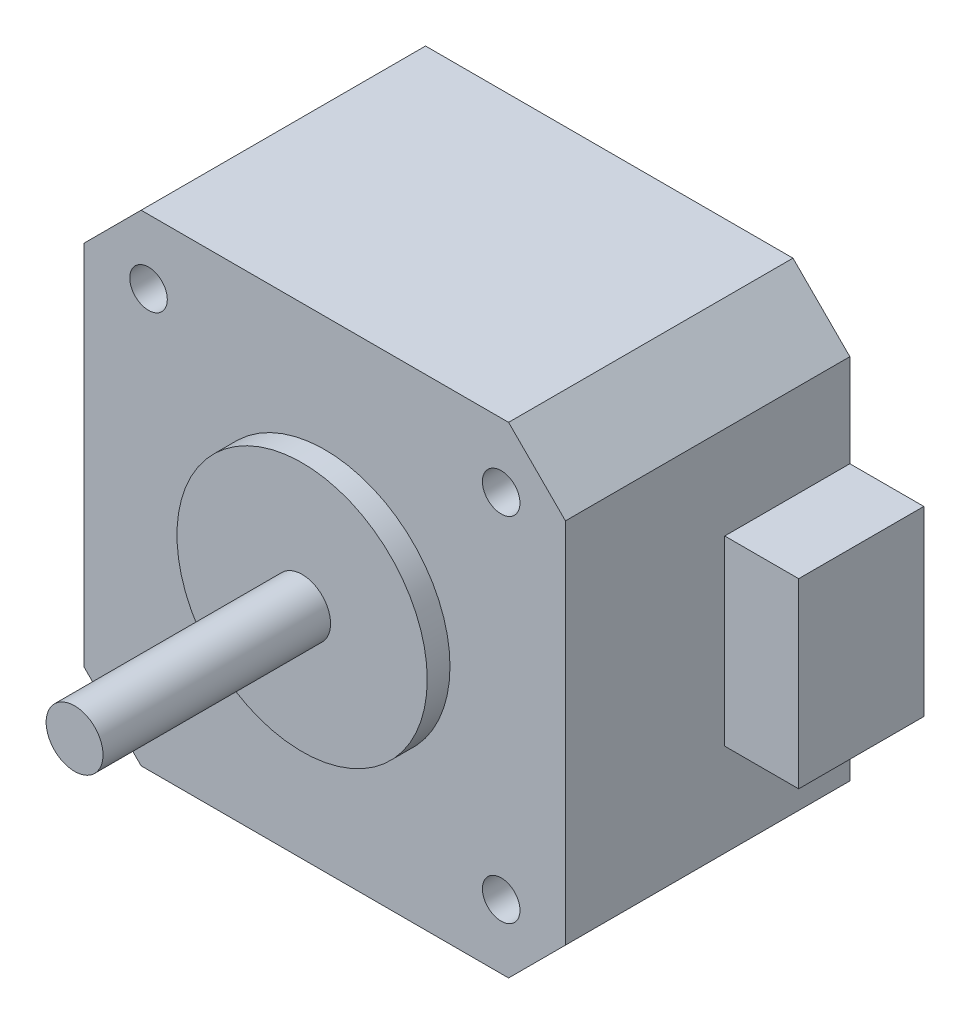
ISO-10303-21;
HEADER;
FILE_DESCRIPTION(('STEP AP214'),'2;1');
FILE_NAME('part.step','',(''),(''),'','','');
FILE_SCHEMA(('AUTOMOTIVE_DESIGN { 1 0 10303 214 1 1 1 1 }'));
ENDSEC;
DATA;
#1=APPLICATION_CONTEXT('core data for automotive mechanical design processes');
#2=APPLICATION_PROTOCOL_DEFINITION('international standard','automotive_design',2000,#1);
#3=PRODUCT_CONTEXT('',#1,'mechanical');
#4=PRODUCT('Part','Part','',(#3));
#5=PRODUCT_RELATED_PRODUCT_CATEGORY('part','',(#4));
#6=PRODUCT_DEFINITION_FORMATION('','',#4);
#7=PRODUCT_DEFINITION_CONTEXT('part definition',#1,'design');
#8=PRODUCT_DEFINITION('design','',#6,#7);
#9=PRODUCT_DEFINITION_SHAPE('','',#8);
#10=(LENGTH_UNIT() NAMED_UNIT(*) SI_UNIT(.MILLI.,.METRE.));
#11=(NAMED_UNIT(*) PLANE_ANGLE_UNIT() SI_UNIT($,.RADIAN.));
#12=(NAMED_UNIT(*) SI_UNIT($,.STERADIAN.) SOLID_ANGLE_UNIT());
#13=UNCERTAINTY_MEASURE_WITH_UNIT(LENGTH_MEASURE(1.E-05),#10,'distance_accuracy_value','');
#14=(GEOMETRIC_REPRESENTATION_CONTEXT(3) GLOBAL_UNCERTAINTY_ASSIGNED_CONTEXT((#13)) GLOBAL_UNIT_ASSIGNED_CONTEXT((#10,
#11,#12)) REPRESENTATION_CONTEXT('',''));
#15=CARTESIAN_POINT('',(0.,0.,0.));
#16=DIRECTION('',(0.,0.,1.));
#17=DIRECTION('',(1.,0.,0.));
#18=AXIS2_PLACEMENT_3D('',#15,#16,#17);
#19=CARTESIAN_POINT('',(27.65,-8.,11.));
#20=DIRECTION('',(0.,0.,-1.));
#21=DIRECTION('',(0.,1.,0.));
#22=AXIS2_PLACEMENT_3D('',#19,#20,#21);
#23=PLANE('',#22);
#24=DIRECTION('',(0.,-1.,0.));
#25=VECTOR('',#24,1.);
#26=CARTESIAN_POINT('',(21.15,-8.,11.));
#27=LINE('',#26,#25);
#28=CARTESIAN_POINT('',(21.15,8.,11.));
#29=VERTEX_POINT('',#28);
#30=CARTESIAN_POINT('',(21.15,-8.,11.));
#31=VERTEX_POINT('',#30);
#32=EDGE_CURVE('E110',#29,#31,#27,.T.);
#33=ORIENTED_EDGE('',*,*,#32,.T.);
#34=DIRECTION('',(-1.,0.,0.));
#35=VECTOR('',#34,1.);
#36=CARTESIAN_POINT('',(27.65,-8.,11.));
#37=LINE('',#36,#35);
#38=CARTESIAN_POINT('',(27.65,-8.,11.));
#39=VERTEX_POINT('',#38);
#40=EDGE_CURVE('E12',#39,#31,#37,.T.);
#41=ORIENTED_EDGE('',*,*,#40,.F.);
#42=DIRECTION('',(0.,-1.,0.));
#43=VECTOR('',#42,1.);
#44=CARTESIAN_POINT('',(27.65,-8.,11.));
#45=LINE('',#44,#43);
#46=CARTESIAN_POINT('',(27.65,8.,11.));
#47=VERTEX_POINT('',#46);
#48=EDGE_CURVE('E98',#47,#39,#45,.T.);
#49=ORIENTED_EDGE('',*,*,#48,.F.);
#50=DIRECTION('',(-1.,0.,0.));
#51=VECTOR('',#50,1.);
#52=CARTESIAN_POINT('',(27.65,8.,11.));
#53=LINE('',#52,#51);
#54=EDGE_CURVE('E106',#47,#29,#53,.T.);
#55=ORIENTED_EDGE('',*,*,#54,.T.);
#56=EDGE_LOOP('',(#33,#41,#49,#55));
#57=FACE_BOUND('',#56,.T.);
#58=ADVANCED_FACE('F47',(#57),#23,.F.);
#59=CARTESIAN_POINT('',(27.65,-8.,11.));
#60=DIRECTION('',(0.,1.,0.));
#61=DIRECTION('',(0.,0.,1.));
#62=AXIS2_PLACEMENT_3D('',#59,#60,#61);
#63=PLANE('',#62);
#64=DIRECTION('',(0.,0.,-1.));
#65=VECTOR('',#64,1.);
#66=CARTESIAN_POINT('',(21.15,-8.,11.));
#67=LINE('',#66,#65);
#68=CARTESIAN_POINT('',(21.15,-8.,0.));
#69=VERTEX_POINT('',#68);
#70=EDGE_CURVE('E102',#31,#69,#67,.T.);
#71=ORIENTED_EDGE('',*,*,#70,.T.);
#72=DIRECTION('',(-1.,0.,0.));
#73=VECTOR('',#72,1.);
#74=CARTESIAN_POINT('',(27.65,-8.,0.));
#75=LINE('',#74,#73);
#76=CARTESIAN_POINT('',(27.65,-8.,0.));
#77=VERTEX_POINT('',#76);
#78=EDGE_CURVE('E55',#77,#69,#75,.T.);
#79=ORIENTED_EDGE('',*,*,#78,.F.);
#80=DIRECTION('',(0.,0.,-1.));
#81=VECTOR('',#80,1.);
#82=CARTESIAN_POINT('',(27.65,-8.,11.));
#83=LINE('',#82,#81);
#84=EDGE_CURVE('E93',#39,#77,#83,.T.);
#85=ORIENTED_EDGE('',*,*,#84,.F.);
#86=ORIENTED_EDGE('',*,*,#40,.T.);
#87=EDGE_LOOP('',(#71,#79,#85,#86));
#88=FACE_BOUND('',#87,.T.);
#89=ADVANCED_FACE('F101',(#88),#63,.F.);
#90=CARTESIAN_POINT('',(27.65,-8.,0.));
#91=DIRECTION('',(0.,0.,1.));
#92=DIRECTION('',(0.,-1.,0.));
#93=AXIS2_PLACEMENT_3D('',#90,#91,#92);
#94=PLANE('',#93);
#95=DIRECTION('',(0.,1.,0.));
#96=VECTOR('',#95,1.);
#97=CARTESIAN_POINT('',(21.15,-8.,0.));
#98=LINE('',#97,#96);
#99=CARTESIAN_POINT('',(21.15,8.,0.));
#100=VERTEX_POINT('',#99);
#101=EDGE_CURVE('E80',#69,#100,#98,.T.);
#102=ORIENTED_EDGE('',*,*,#101,.T.);
#103=DIRECTION('',(-1.,0.,0.));
#104=VECTOR('',#103,1.);
#105=CARTESIAN_POINT('',(27.65,8.,0.));
#106=LINE('',#105,#104);
#107=CARTESIAN_POINT('',(27.65,8.,0.));
#108=VERTEX_POINT('',#107);
#109=EDGE_CURVE('E103',#108,#100,#106,.T.);
#110=ORIENTED_EDGE('',*,*,#109,.F.);
#111=DIRECTION('',(0.,1.,0.));
#112=VECTOR('',#111,1.);
#113=CARTESIAN_POINT('',(27.65,-8.,0.));
#114=LINE('',#113,#112);
#115=EDGE_CURVE('E96',#77,#108,#114,.T.);
#116=ORIENTED_EDGE('',*,*,#115,.F.);
#117=ORIENTED_EDGE('',*,*,#78,.T.);
#118=EDGE_LOOP('',(#102,#110,#116,#117));
#119=FACE_BOUND('',#118,.T.);
#120=ADVANCED_FACE('F104',(#119),#94,.F.);
#121=CARTESIAN_POINT('',(27.65,8.,11.));
#122=DIRECTION('',(0.,-1.,0.));
#123=DIRECTION('',(0.,0.,-1.));
#124=AXIS2_PLACEMENT_3D('',#121,#122,#123);
#125=PLANE('',#124);
#126=DIRECTION('',(0.,0.,1.));
#127=VECTOR('',#126,1.);
#128=CARTESIAN_POINT('',(21.15,8.,11.));
#129=LINE('',#128,#127);
#130=EDGE_CURVE('E86',#100,#29,#129,.T.);
#131=ORIENTED_EDGE('',*,*,#130,.T.);
#132=ORIENTED_EDGE('',*,*,#54,.F.);
#133=DIRECTION('',(0.,0.,1.));
#134=VECTOR('',#133,1.);
#135=CARTESIAN_POINT('',(27.65,8.,11.));
#136=LINE('',#135,#134);
#137=EDGE_CURVE('E63',#108,#47,#136,.T.);
#138=ORIENTED_EDGE('',*,*,#137,.F.);
#139=ORIENTED_EDGE('',*,*,#109,.T.);
#140=EDGE_LOOP('',(#131,#132,#138,#139));
#141=FACE_BOUND('',#140,.T.);
#142=ADVANCED_FACE('F117',(#141),#125,.F.);
#143=CARTESIAN_POINT('',(27.65,0.,0.));
#144=DIRECTION('',(-1.,0.,0.));
#145=DIRECTION('',(0.,0.,1.));
#146=AXIS2_PLACEMENT_3D('',#143,#144,#145);
#147=PLANE('',#146);
#148=ORIENTED_EDGE('',*,*,#48,.T.);
#149=ORIENTED_EDGE('',*,*,#84,.T.);
#150=ORIENTED_EDGE('',*,*,#115,.T.);
#151=ORIENTED_EDGE('',*,*,#137,.T.);
#152=EDGE_LOOP('',(#148,#149,#150,#151));
#153=FACE_BOUND('',#152,.T.);
#154=ADVANCED_FACE('F94',(#153),#147,.F.);
#155=CARTESIAN_POINT('',(21.15,0.,0.));
#156=DIRECTION('',(-1.,0.,0.));
#157=DIRECTION('',(0.,0.,1.));
#158=AXIS2_PLACEMENT_3D('',#155,#156,#157);
#159=PLANE('',#158);
#160=ORIENTED_EDGE('',*,*,#32,.F.);
#161=ORIENTED_EDGE('',*,*,#130,.F.);
#162=ORIENTED_EDGE('',*,*,#101,.F.);
#163=ORIENTED_EDGE('',*,*,#70,.F.);
#164=EDGE_LOOP('',(#160,#161,#162,#163));
#165=FACE_BOUND('',#164,.T.);
#166=ADVANCED_FACE('F120',(#165),#159,.T.);
#167=CLOSED_SHELL('',(#58,#89,#120,#142,#154,#166));
#168=MANIFOLD_SOLID_BREP('B2',#167);
#169=CARTESIAN_POINT('',(21.15,-21.1500000000001,25.));
#170=DIRECTION('',(-1.,0.,0.));
#171=DIRECTION('',(0.,0.,1.));
#172=AXIS2_PLACEMENT_3D('',#169,#170,#171);
#173=PLANE('',#172);
#174=DIRECTION('',(0.,1.,0.));
#175=VECTOR('',#174,1.);
#176=CARTESIAN_POINT('',(21.15,-21.1500000000001,25.));
#177=LINE('',#176,#175);
#178=CARTESIAN_POINT('',(21.15,-16.1500000000001,25.));
#179=VERTEX_POINT('',#178);
#180=CARTESIAN_POINT('',(21.15,16.1499999999999,25.));
#181=VERTEX_POINT('',#180);
#182=EDGE_CURVE('E293',#179,#181,#177,.T.);
#183=ORIENTED_EDGE('',*,*,#182,.F.);
#184=DIRECTION('',(0.,0.,-1.));
#185=VECTOR('',#184,1.);
#186=CARTESIAN_POINT('',(21.15,-16.1500000000001,25.));
#187=LINE('',#186,#185);
#188=CARTESIAN_POINT('',(21.15,-16.1500000000001,0.));
#189=VERTEX_POINT('',#188);
#190=EDGE_CURVE('E340',#179,#189,#187,.T.);
#191=ORIENTED_EDGE('',*,*,#190,.T.);
#192=DIRECTION('',(0.,1.,0.));
#193=VECTOR('',#192,1.);
#194=CARTESIAN_POINT('',(21.15,-21.1500000000001,0.));
#195=LINE('',#194,#193);
#196=CARTESIAN_POINT('',(21.15,16.1499999999999,0.));
#197=VERTEX_POINT('',#196);
#198=EDGE_CURVE('E290',#189,#197,#195,.T.);
#199=ORIENTED_EDGE('',*,*,#198,.T.);
#200=DIRECTION('',(0.,0.,1.));
#201=VECTOR('',#200,1.);
#202=CARTESIAN_POINT('',(21.15,16.1499999999999,25.));
#203=LINE('',#202,#201);
#204=EDGE_CURVE('E338',#197,#181,#203,.T.);
#205=ORIENTED_EDGE('',*,*,#204,.T.);
#206=EDGE_LOOP('',(#183,#191,#199,#205));
#207=FACE_BOUND('',#206,.T.);
#208=ADVANCED_FACE('F171',(#207),#173,.F.);
#209=CARTESIAN_POINT('',(-21.15,21.1499999999999,25.));
#210=DIRECTION('',(0.,-1.,0.));
#211=DIRECTION('',(0.,0.,-1.));
#212=AXIS2_PLACEMENT_3D('',#209,#210,#211);
#213=PLANE('',#212);
#214=DIRECTION('',(-1.,0.,0.));
#215=VECTOR('',#214,1.);
#216=CARTESIAN_POINT('',(-21.15,21.1499999999999,25.));
#217=LINE('',#216,#215);
#218=CARTESIAN_POINT('',(16.15,21.1499999999999,25.));
#219=VERTEX_POINT('',#218);
#220=CARTESIAN_POINT('',(-16.15,21.1499999999999,25.));
#221=VERTEX_POINT('',#220);
#222=EDGE_CURVE('E295',#219,#221,#217,.T.);
#223=ORIENTED_EDGE('',*,*,#222,.F.);
#224=DIRECTION('',(0.,0.,-1.));
#225=VECTOR('',#224,1.);
#226=CARTESIAN_POINT('',(16.15,21.1499999999999,25.));
#227=LINE('',#226,#225);
#228=CARTESIAN_POINT('',(16.15,21.1499999999999,0.));
#229=VERTEX_POINT('',#228);
#230=EDGE_CURVE('E176',#219,#229,#227,.T.);
#231=ORIENTED_EDGE('',*,*,#230,.T.);
#232=DIRECTION('',(-1.,0.,0.));
#233=VECTOR('',#232,1.);
#234=CARTESIAN_POINT('',(-21.15,21.1499999999999,0.));
#235=LINE('',#234,#233);
#236=CARTESIAN_POINT('',(-16.15,21.1499999999999,0.));
#237=VERTEX_POINT('',#236);
#238=EDGE_CURVE('E307',#229,#237,#235,.T.);
#239=ORIENTED_EDGE('',*,*,#238,.T.);
#240=DIRECTION('',(0.,0.,1.));
#241=VECTOR('',#240,1.);
#242=CARTESIAN_POINT('',(-16.15,21.1499999999999,25.));
#243=LINE('',#242,#241);
#244=EDGE_CURVE('E189',#237,#221,#243,.T.);
#245=ORIENTED_EDGE('',*,*,#244,.T.);
#246=EDGE_LOOP('',(#223,#231,#239,#245));
#247=FACE_BOUND('',#246,.T.);
#248=ADVANCED_FACE('F345',(#247),#213,.F.);
#249=CARTESIAN_POINT('',(-21.15,-21.1500000000001,25.));
#250=DIRECTION('',(1.,0.,0.));
#251=DIRECTION('',(0.,0.,-1.));
#252=AXIS2_PLACEMENT_3D('',#249,#250,#251);
#253=PLANE('',#252);
#254=DIRECTION('',(0.,-1.,0.));
#255=VECTOR('',#254,1.);
#256=CARTESIAN_POINT('',(-21.15,-21.1500000000001,0.));
#257=LINE('',#256,#255);
#258=CARTESIAN_POINT('',(-21.15,16.1499999999999,0.));
#259=VERTEX_POINT('',#258);
#260=CARTESIAN_POINT('',(-21.15,-16.1500000000001,0.));
#261=VERTEX_POINT('',#260);
#262=EDGE_CURVE('E309',#259,#261,#257,.T.);
#263=ORIENTED_EDGE('',*,*,#262,.T.);
#264=DIRECTION('',(0.,0.,1.));
#265=VECTOR('',#264,1.);
#266=CARTESIAN_POINT('',(-21.15,-16.1500000000001,25.));
#267=LINE('',#266,#265);
#268=CARTESIAN_POINT('',(-21.15,-16.1500000000001,25.));
#269=VERTEX_POINT('',#268);
#270=EDGE_CURVE('E329',#261,#269,#267,.T.);
#271=ORIENTED_EDGE('',*,*,#270,.T.);
#272=DIRECTION('',(0.,-1.,0.));
#273=VECTOR('',#272,1.);
#274=CARTESIAN_POINT('',(-21.15,-21.1500000000001,25.));
#275=LINE('',#274,#273);
#276=CARTESIAN_POINT('',(-21.15,16.1499999999999,25.));
#277=VERTEX_POINT('',#276);
#278=EDGE_CURVE('E298',#277,#269,#275,.T.);
#279=ORIENTED_EDGE('',*,*,#278,.F.);
#280=DIRECTION('',(0.,0.,-1.));
#281=VECTOR('',#280,1.);
#282=CARTESIAN_POINT('',(-21.15,16.1499999999999,25.));
#283=LINE('',#282,#281);
#284=EDGE_CURVE('E326',#277,#259,#283,.T.);
#285=ORIENTED_EDGE('',*,*,#284,.T.);
#286=EDGE_LOOP('',(#263,#271,#279,#285));
#287=FACE_BOUND('',#286,.T.);
#288=ADVANCED_FACE('F357',(#287),#253,.F.);
#289=CARTESIAN_POINT('',(-21.15,-21.1500000000001,25.));
#290=DIRECTION('',(0.,1.,0.));
#291=DIRECTION('',(0.,0.,1.));
#292=AXIS2_PLACEMENT_3D('',#289,#290,#291);
#293=PLANE('',#292);
#294=DIRECTION('',(1.,0.,0.));
#295=VECTOR('',#294,1.);
#296=CARTESIAN_POINT('',(-21.15,-21.1500000000001,25.));
#297=LINE('',#296,#295);
#298=CARTESIAN_POINT('',(-16.15,-21.1500000000001,25.));
#299=VERTEX_POINT('',#298);
#300=CARTESIAN_POINT('',(16.15,-21.1500000000001,25.));
#301=VERTEX_POINT('',#300);
#302=EDGE_CURVE('E301',#299,#301,#297,.T.);
#303=ORIENTED_EDGE('',*,*,#302,.F.);
#304=DIRECTION('',(0.,0.,-1.));
#305=VECTOR('',#304,1.);
#306=CARTESIAN_POINT('',(-16.15,-21.1500000000001,25.));
#307=LINE('',#306,#305);
#308=CARTESIAN_POINT('',(-16.15,-21.1500000000001,0.));
#309=VERTEX_POINT('',#308);
#310=EDGE_CURVE('E315',#299,#309,#307,.T.);
#311=ORIENTED_EDGE('',*,*,#310,.T.);
#312=DIRECTION('',(1.,0.,0.));
#313=VECTOR('',#312,1.);
#314=CARTESIAN_POINT('',(-21.15,-21.1500000000001,0.));
#315=LINE('',#314,#313);
#316=CARTESIAN_POINT('',(16.15,-21.1500000000001,0.));
#317=VERTEX_POINT('',#316);
#318=EDGE_CURVE('E296',#309,#317,#315,.T.);
#319=ORIENTED_EDGE('',*,*,#318,.T.);
#320=DIRECTION('',(0.,0.,1.));
#321=VECTOR('',#320,1.);
#322=CARTESIAN_POINT('',(16.15,-21.1500000000001,25.));
#323=LINE('',#322,#321);
#324=EDGE_CURVE('E304',#317,#301,#323,.T.);
#325=ORIENTED_EDGE('',*,*,#324,.T.);
#326=EDGE_LOOP('',(#303,#311,#319,#325));
#327=FACE_BOUND('',#326,.T.);
#328=ADVANCED_FACE('F366',(#327),#293,.F.);
#329=CARTESIAN_POINT('',(0.,0.,25.));
#330=DIRECTION('',(0.,0.,-1.));
#331=DIRECTION('',(-1.,0.,0.));
#332=AXIS2_PLACEMENT_3D('',#329,#330,#331);
#333=PLANE('',#332);
#334=CARTESIAN_POINT('',(-15.5,-15.5,25.));
#335=DIRECTION('',(0.,0.,1.));
#336=DIRECTION('',(1.,0.,0.));
#337=AXIS2_PLACEMENT_3D('',#334,#335,#336);
#338=CIRCLE('',#337,1.64999999999999);
#339=CARTESIAN_POINT('',(-13.85,-15.5,25.));
#340=VERTEX_POINT('',#339);
#341=EDGE_CURVE('E262',#340,#340,#338,.T.);
#342=ORIENTED_EDGE('',*,*,#341,.F.);
#343=EDGE_LOOP('',(#342));
#344=FACE_BOUND('',#343,.T.);
#345=CARTESIAN_POINT('',(15.5,15.5,25.));
#346=DIRECTION('',(0.,0.,1.));
#347=DIRECTION('',(1.,0.,0.));
#348=AXIS2_PLACEMENT_3D('',#345,#346,#347);
#349=CIRCLE('',#348,1.64999999999999);
#350=CARTESIAN_POINT('',(17.15,15.5,25.));
#351=VERTEX_POINT('',#350);
#352=EDGE_CURVE('E261',#351,#351,#349,.T.);
#353=ORIENTED_EDGE('',*,*,#352,.F.);
#354=EDGE_LOOP('',(#353));
#355=FACE_BOUND('',#354,.T.);
#356=CARTESIAN_POINT('',(-15.5,15.5,25.));
#357=DIRECTION('',(0.,0.,1.));
#358=DIRECTION('',(1.,0.,0.));
#359=AXIS2_PLACEMENT_3D('',#356,#357,#358);
#360=CIRCLE('',#359,1.64999999999999);
#361=CARTESIAN_POINT('',(-13.85,15.5,25.));
#362=VERTEX_POINT('',#361);
#363=EDGE_CURVE('E272',#362,#362,#360,.T.);
#364=ORIENTED_EDGE('',*,*,#363,.F.);
#365=EDGE_LOOP('',(#364));
#366=FACE_BOUND('',#365,.T.);
#367=CARTESIAN_POINT('',(15.5,-15.5,25.));
#368=DIRECTION('',(0.,0.,1.));
#369=DIRECTION('',(1.,0.,0.));
#370=AXIS2_PLACEMENT_3D('',#367,#368,#369);
#371=CIRCLE('',#370,1.64999999999999);
#372=CARTESIAN_POINT('',(17.15,-15.5,25.));
#373=VERTEX_POINT('',#372);
#374=EDGE_CURVE('E278',#373,#373,#371,.T.);
#375=ORIENTED_EDGE('',*,*,#374,.F.);
#376=EDGE_LOOP('',(#375));
#377=FACE_BOUND('',#376,.T.);
#378=CARTESIAN_POINT('',(0.,0.,25.));
#379=DIRECTION('',(0.,0.,1.));
#380=DIRECTION('',(1.,0.,0.));
#381=AXIS2_PLACEMENT_3D('',#378,#379,#380);
#382=CIRCLE('',#381,11.);
#383=CARTESIAN_POINT('',(11.,0.,25.));
#384=VERTEX_POINT('',#383);
#385=EDGE_CURVE('E181',#384,#384,#382,.T.);
#386=ORIENTED_EDGE('',*,*,#385,.F.);
#387=EDGE_LOOP('',(#386));
#388=FACE_BOUND('',#387,.T.);
#389=ORIENTED_EDGE('',*,*,#278,.T.);
#390=DIRECTION('',(-0.707106781186547,0.707106781186549,0.));
#391=VECTOR('',#390,1.);
#392=CARTESIAN_POINT('',(-16.15,-21.1500000000001,25.));
#393=LINE('',#392,#391);
#394=EDGE_CURVE('E336',#269,#299,#393,.F.);
#395=ORIENTED_EDGE('',*,*,#394,.T.);
#396=ORIENTED_EDGE('',*,*,#302,.T.);
#397=DIRECTION('',(-0.707106781186549,-0.707106781186547,0.));
#398=VECTOR('',#397,1.);
#399=CARTESIAN_POINT('',(21.15,-16.1500000000001,25.));
#400=LINE('',#399,#398);
#401=EDGE_CURVE('E334',#301,#179,#400,.F.);
#402=ORIENTED_EDGE('',*,*,#401,.T.);
#403=ORIENTED_EDGE('',*,*,#182,.T.);
#404=DIRECTION('',(0.707106781186547,-0.707106781186549,0.));
#405=VECTOR('',#404,1.);
#406=CARTESIAN_POINT('',(16.15,21.1499999999999,25.));
#407=LINE('',#406,#405);
#408=EDGE_CURVE('E196',#181,#219,#407,.F.);
#409=ORIENTED_EDGE('',*,*,#408,.T.);
#410=ORIENTED_EDGE('',*,*,#222,.T.);
#411=DIRECTION('',(0.707106781186549,0.707106781186547,0.));
#412=VECTOR('',#411,1.);
#413=CARTESIAN_POINT('',(-21.15,16.1499999999999,25.));
#414=LINE('',#413,#412);
#415=EDGE_CURVE('E331',#221,#277,#414,.F.);
#416=ORIENTED_EDGE('',*,*,#415,.T.);
#417=EDGE_LOOP('',(#389,#395,#396,#402,#403,#409,#410,#416));
#418=FACE_BOUND('',#417,.T.);
#419=ADVANCED_FACE('F360',(#344,#355,#366,#377,#388,#418),#333,.F.);
#420=CARTESIAN_POINT('',(0.,0.,0.));
#421=DIRECTION('',(0.,0.,-1.));
#422=DIRECTION('',(-1.,0.,0.));
#423=AXIS2_PLACEMENT_3D('',#420,#421,#422);
#424=PLANE('',#423);
#425=ORIENTED_EDGE('',*,*,#318,.F.);
#426=DIRECTION('',(0.707106781186547,-0.707106781186549,0.));
#427=VECTOR('',#426,1.);
#428=CARTESIAN_POINT('',(-18.6500000000001,-18.65,0.));
#429=LINE('',#428,#427);
#430=EDGE_CURVE('E324',#309,#261,#429,.F.);
#431=ORIENTED_EDGE('',*,*,#430,.T.);
#432=ORIENTED_EDGE('',*,*,#262,.F.);
#433=DIRECTION('',(-0.707106781186549,-0.707106781186547,0.));
#434=VECTOR('',#433,1.);
#435=CARTESIAN_POINT('',(-18.6499999999999,18.65,0.));
#436=LINE('',#435,#434);
#437=EDGE_CURVE('E318',#259,#237,#436,.F.);
#438=ORIENTED_EDGE('',*,*,#437,.T.);
#439=ORIENTED_EDGE('',*,*,#238,.F.);
#440=DIRECTION('',(-0.707106781186547,0.707106781186549,0.));
#441=VECTOR('',#440,1.);
#442=CARTESIAN_POINT('',(18.65,18.6499999999999,0.));
#443=LINE('',#442,#441);
#444=EDGE_CURVE('E320',#229,#197,#443,.F.);
#445=ORIENTED_EDGE('',*,*,#444,.T.);
#446=ORIENTED_EDGE('',*,*,#198,.F.);
#447=DIRECTION('',(0.707106781186549,0.707106781186547,0.));
#448=VECTOR('',#447,1.);
#449=CARTESIAN_POINT('',(18.65,-18.6500000000001,0.));
#450=LINE('',#449,#448);
#451=EDGE_CURVE('E322',#189,#317,#450,.F.);
#452=ORIENTED_EDGE('',*,*,#451,.T.);
#453=EDGE_LOOP('',(#425,#431,#432,#438,#439,#445,#446,#452));
#454=FACE_BOUND('',#453,.T.);
#455=ADVANCED_FACE('F349',(#454),#424,.T.);
#456=CARTESIAN_POINT('',(-16.15,-21.1500000000001,25.));
#457=DIRECTION('',(0.707106781186549,0.707106781186547,0.));
#458=DIRECTION('',(0.,0.,-1.));
#459=AXIS2_PLACEMENT_3D('',#456,#457,#458);
#460=PLANE('',#459);
#461=ORIENTED_EDGE('',*,*,#394,.F.);
#462=ORIENTED_EDGE('',*,*,#270,.F.);
#463=ORIENTED_EDGE('',*,*,#430,.F.);
#464=ORIENTED_EDGE('',*,*,#310,.F.);
#465=EDGE_LOOP('',(#461,#462,#463,#464));
#466=FACE_BOUND('',#465,.T.);
#467=ADVANCED_FACE('F364',(#466),#460,.F.);
#468=CARTESIAN_POINT('',(21.15,-16.1500000000001,25.));
#469=DIRECTION('',(-0.707106781186547,0.707106781186549,0.));
#470=DIRECTION('',(0.,0.,-1.));
#471=AXIS2_PLACEMENT_3D('',#468,#469,#470);
#472=PLANE('',#471);
#473=ORIENTED_EDGE('',*,*,#401,.F.);
#474=ORIENTED_EDGE('',*,*,#324,.F.);
#475=ORIENTED_EDGE('',*,*,#451,.F.);
#476=ORIENTED_EDGE('',*,*,#190,.F.);
#477=EDGE_LOOP('',(#473,#474,#475,#476));
#478=FACE_BOUND('',#477,.T.);
#479=ADVANCED_FACE('F371',(#478),#472,.F.);
#480=CARTESIAN_POINT('',(16.15,21.1499999999999,25.));
#481=DIRECTION('',(-0.707106781186549,-0.707106781186547,0.));
#482=DIRECTION('',(0.,0.,-1.));
#483=AXIS2_PLACEMENT_3D('',#480,#481,#482);
#484=PLANE('',#483);
#485=ORIENTED_EDGE('',*,*,#408,.F.);
#486=ORIENTED_EDGE('',*,*,#204,.F.);
#487=ORIENTED_EDGE('',*,*,#444,.F.);
#488=ORIENTED_EDGE('',*,*,#230,.F.);
#489=EDGE_LOOP('',(#485,#486,#487,#488));
#490=FACE_BOUND('',#489,.T.);
#491=ADVANCED_FACE('F375',(#490),#484,.F.);
#492=CARTESIAN_POINT('',(-21.15,16.1499999999999,25.));
#493=DIRECTION('',(0.707106781186547,-0.707106781186549,0.));
#494=DIRECTION('',(0.,0.,-1.));
#495=AXIS2_PLACEMENT_3D('',#492,#493,#494);
#496=PLANE('',#495);
#497=ORIENTED_EDGE('',*,*,#415,.F.);
#498=ORIENTED_EDGE('',*,*,#244,.F.);
#499=ORIENTED_EDGE('',*,*,#437,.F.);
#500=ORIENTED_EDGE('',*,*,#284,.F.);
#501=EDGE_LOOP('',(#497,#498,#499,#500));
#502=FACE_BOUND('',#501,.T.);
#503=ADVANCED_FACE('F174',(#502),#496,.F.);
#504=CARTESIAN_POINT('',(0.,0.,27.));
#505=DIRECTION('',(0.,0.,-1.));
#506=DIRECTION('',(-1.,0.,0.));
#507=AXIS2_PLACEMENT_3D('',#504,#505,#506);
#508=CYLINDRICAL_SURFACE('',#507,11.);
#509=CARTESIAN_POINT('',(0.,0.,27.));
#510=DIRECTION('',(0.,0.,1.));
#511=DIRECTION('',(1.,0.,0.));
#512=AXIS2_PLACEMENT_3D('',#509,#510,#511);
#513=CIRCLE('',#512,11.);
#514=CARTESIAN_POINT('',(11.,0.,27.));
#515=VERTEX_POINT('',#514);
#516=EDGE_CURVE('E286',#515,#515,#513,.T.);
#517=ORIENTED_EDGE('',*,*,#516,.F.);
#518=EDGE_LOOP('',(#517));
#519=FACE_BOUND('',#518,.T.);
#520=ORIENTED_EDGE('',*,*,#385,.T.);
#521=EDGE_LOOP('',(#520));
#522=FACE_BOUND('',#521,.T.);
#523=ADVANCED_FACE('F381',(#519,#522),#508,.T.);
#524=CARTESIAN_POINT('',(0.,0.,27.));
#525=DIRECTION('',(0.,0.,1.));
#526=DIRECTION('',(1.,0.,0.));
#527=AXIS2_PLACEMENT_3D('',#524,#525,#526);
#528=PLANE('',#527);
#529=CARTESIAN_POINT('',(0.,0.,27.));
#530=DIRECTION('',(0.,0.,1.));
#531=DIRECTION('',(1.,0.,0.));
#532=AXIS2_PLACEMENT_3D('',#529,#530,#531);
#533=CIRCLE('',#532,2.5);
#534=CARTESIAN_POINT('',(2.5,0.,27.));
#535=VERTEX_POINT('',#534);
#536=EDGE_CURVE('E45',#535,#535,#533,.T.);
#537=ORIENTED_EDGE('',*,*,#536,.F.);
#538=EDGE_LOOP('',(#537));
#539=FACE_BOUND('',#538,.T.);
#540=ORIENTED_EDGE('',*,*,#516,.T.);
#541=EDGE_LOOP('',(#540));
#542=FACE_BOUND('',#541,.T.);
#543=ADVANCED_FACE('F440',(#539,#542),#528,.T.);
#544=CARTESIAN_POINT('',(0.,0.,47.));
#545=DIRECTION('',(0.,0.,-1.));
#546=DIRECTION('',(-1.,0.,0.));
#547=AXIS2_PLACEMENT_3D('',#544,#545,#546);
#548=CYLINDRICAL_SURFACE('',#547,2.5);
#549=CARTESIAN_POINT('',(0.,0.,47.));
#550=DIRECTION('',(0.,0.,1.));
#551=DIRECTION('',(1.,0.,0.));
#552=AXIS2_PLACEMENT_3D('',#549,#550,#551);
#553=CIRCLE('',#552,2.5);
#554=CARTESIAN_POINT('',(2.5,0.,47.));
#555=VERTEX_POINT('',#554);
#556=EDGE_CURVE('E284',#555,#555,#553,.T.);
#557=ORIENTED_EDGE('',*,*,#556,.F.);
#558=EDGE_LOOP('',(#557));
#559=FACE_BOUND('',#558,.T.);
#560=ORIENTED_EDGE('',*,*,#536,.T.);
#561=EDGE_LOOP('',(#560));
#562=FACE_BOUND('',#561,.T.);
#563=ADVANCED_FACE('F444',(#559,#562),#548,.T.);
#564=CARTESIAN_POINT('',(0.,0.,47.));
#565=DIRECTION('',(0.,0.,1.));
#566=DIRECTION('',(1.,0.,0.));
#567=AXIS2_PLACEMENT_3D('',#564,#565,#566);
#568=PLANE('',#567);
#569=ORIENTED_EDGE('',*,*,#556,.T.);
#570=EDGE_LOOP('',(#569));
#571=FACE_BOUND('',#570,.T.);
#572=ADVANCED_FACE('F457',(#571),#568,.T.);
#573=CARTESIAN_POINT('',(15.5,-15.5,20.5));
#574=DIRECTION('',(0.,0.,1.));
#575=DIRECTION('',(1.,0.,0.));
#576=AXIS2_PLACEMENT_3D('',#573,#574,#575);
#577=CONICAL_SURFACE('',#576,1.65,1.02974425867665);
#578=CARTESIAN_POINT('',(15.5,-15.5,19.5085799786045));
#579=VERTEX_POINT('',#578);
#580=VERTEX_LOOP('',#579);
#581=FACE_BOUND('',#580,.T.);
#582=CARTESIAN_POINT('',(15.5,-15.5,20.5));
#583=DIRECTION('',(0.,0.,1.));
#584=DIRECTION('',(1.,0.,0.));
#585=AXIS2_PLACEMENT_3D('',#582,#583,#584);
#586=CIRCLE('',#585,1.65);
#587=CARTESIAN_POINT('',(17.15,-15.5,20.5));
#588=VERTEX_POINT('',#587);
#589=EDGE_CURVE('E281',#588,#588,#586,.T.);
#590=ORIENTED_EDGE('',*,*,#589,.T.);
#591=EDGE_LOOP('',(#590));
#592=FACE_BOUND('',#591,.T.);
#593=ADVANCED_FACE('F464',(#581,#592),#577,.F.);
#594=CARTESIAN_POINT('',(15.5,-15.5,25.));
#595=DIRECTION('',(0.,0.,1.));
#596=DIRECTION('',(1.,0.,0.));
#597=AXIS2_PLACEMENT_3D('',#594,#595,#596);
#598=CYLINDRICAL_SURFACE('',#597,1.64999999999999);
#599=ORIENTED_EDGE('',*,*,#589,.F.);
#600=EDGE_LOOP('',(#599));
#601=FACE_BOUND('',#600,.T.);
#602=ORIENTED_EDGE('',*,*,#374,.T.);
#603=EDGE_LOOP('',(#602));
#604=FACE_BOUND('',#603,.T.);
#605=ADVANCED_FACE('F471',(#601,#604),#598,.F.);
#606=CARTESIAN_POINT('',(-15.5,15.5,20.5));
#607=DIRECTION('',(0.,0.,1.));
#608=DIRECTION('',(1.,0.,0.));
#609=AXIS2_PLACEMENT_3D('',#606,#607,#608);
#610=CONICAL_SURFACE('',#609,1.65,1.02974425867665);
#611=CARTESIAN_POINT('',(-15.5,15.5,19.5085799786045));
#612=VERTEX_POINT('',#611);
#613=VERTEX_LOOP('',#612);
#614=FACE_BOUND('',#613,.T.);
#615=CARTESIAN_POINT('',(-15.5,15.5,20.5));
#616=DIRECTION('',(0.,0.,1.));
#617=DIRECTION('',(1.,0.,0.));
#618=AXIS2_PLACEMENT_3D('',#615,#616,#617);
#619=CIRCLE('',#618,1.65);
#620=CARTESIAN_POINT('',(-13.85,15.5,20.5));
#621=VERTEX_POINT('',#620);
#622=EDGE_CURVE('E275',#621,#621,#619,.T.);
#623=ORIENTED_EDGE('',*,*,#622,.T.);
#624=EDGE_LOOP('',(#623));
#625=FACE_BOUND('',#624,.T.);
#626=ADVANCED_FACE('F480',(#614,#625),#610,.F.);
#627=CARTESIAN_POINT('',(-15.5,15.5,25.));
#628=DIRECTION('',(0.,0.,1.));
#629=DIRECTION('',(1.,0.,0.));
#630=AXIS2_PLACEMENT_3D('',#627,#628,#629);
#631=CYLINDRICAL_SURFACE('',#630,1.64999999999999);
#632=ORIENTED_EDGE('',*,*,#622,.F.);
#633=EDGE_LOOP('',(#632));
#634=FACE_BOUND('',#633,.T.);
#635=ORIENTED_EDGE('',*,*,#363,.T.);
#636=EDGE_LOOP('',(#635));
#637=FACE_BOUND('',#636,.T.);
#638=ADVANCED_FACE('F489',(#634,#637),#631,.F.);
#639=CARTESIAN_POINT('',(15.5,15.5,20.5));
#640=DIRECTION('',(0.,0.,1.));
#641=DIRECTION('',(1.,0.,0.));
#642=AXIS2_PLACEMENT_3D('',#639,#640,#641);
#643=CONICAL_SURFACE('',#642,1.65,1.02974425867665);
#644=CARTESIAN_POINT('',(15.5,15.5,19.5085799786045));
#645=VERTEX_POINT('',#644);
#646=VERTEX_LOOP('',#645);
#647=FACE_BOUND('',#646,.T.);
#648=CARTESIAN_POINT('',(15.5,15.5,20.5));
#649=DIRECTION('',(0.,0.,1.));
#650=DIRECTION('',(1.,0.,0.));
#651=AXIS2_PLACEMENT_3D('',#648,#649,#650);
#652=CIRCLE('',#651,1.65);
#653=CARTESIAN_POINT('',(17.15,15.5,20.5));
#654=VERTEX_POINT('',#653);
#655=EDGE_CURVE('E265',#654,#654,#652,.T.);
#656=ORIENTED_EDGE('',*,*,#655,.T.);
#657=EDGE_LOOP('',(#656));
#658=FACE_BOUND('',#657,.T.);
#659=ADVANCED_FACE('F497',(#647,#658),#643,.F.);
#660=CARTESIAN_POINT('',(15.5,15.5,25.));
#661=DIRECTION('',(0.,0.,1.));
#662=DIRECTION('',(1.,0.,0.));
#663=AXIS2_PLACEMENT_3D('',#660,#661,#662);
#664=CYLINDRICAL_SURFACE('',#663,1.64999999999999);
#665=ORIENTED_EDGE('',*,*,#655,.F.);
#666=EDGE_LOOP('',(#665));
#667=FACE_BOUND('',#666,.T.);
#668=ORIENTED_EDGE('',*,*,#352,.T.);
#669=EDGE_LOOP('',(#668));
#670=FACE_BOUND('',#669,.T.);
#671=ADVANCED_FACE('F255',(#667,#670),#664,.F.);
#672=CARTESIAN_POINT('',(-15.5,-15.5,20.5));
#673=DIRECTION('',(0.,0.,1.));
#674=DIRECTION('',(1.,0.,0.));
#675=AXIS2_PLACEMENT_3D('',#672,#673,#674);
#676=CONICAL_SURFACE('',#675,1.65,1.02974425867665);
#677=CARTESIAN_POINT('',(-15.5,-15.5,19.5085799786045));
#678=VERTEX_POINT('',#677);
#679=VERTEX_LOOP('',#678);
#680=FACE_BOUND('',#679,.T.);
#681=CARTESIAN_POINT('',(-15.5,-15.5,20.5));
#682=DIRECTION('',(0.,0.,1.));
#683=DIRECTION('',(1.,0.,0.));
#684=AXIS2_PLACEMENT_3D('',#681,#682,#683);
#685=CIRCLE('',#684,1.65);
#686=CARTESIAN_POINT('',(-13.85,-15.5,20.5));
#687=VERTEX_POINT('',#686);
#688=EDGE_CURVE('E259',#687,#687,#685,.T.);
#689=ORIENTED_EDGE('',*,*,#688,.T.);
#690=EDGE_LOOP('',(#689));
#691=FACE_BOUND('',#690,.T.);
#692=ADVANCED_FACE('F251',(#680,#691),#676,.F.);
#693=CARTESIAN_POINT('',(-15.5,-15.5,25.));
#694=DIRECTION('',(0.,0.,1.));
#695=DIRECTION('',(1.,0.,0.));
#696=AXIS2_PLACEMENT_3D('',#693,#694,#695);
#697=CYLINDRICAL_SURFACE('',#696,1.64999999999999);
#698=ORIENTED_EDGE('',*,*,#688,.F.);
#699=EDGE_LOOP('',(#698));
#700=FACE_BOUND('',#699,.T.);
#701=ORIENTED_EDGE('',*,*,#341,.T.);
#702=EDGE_LOOP('',(#701));
#703=FACE_BOUND('',#702,.T.);
#704=ADVANCED_FACE('F254',(#700,#703),#697,.F.);
#705=CLOSED_SHELL('',(#208,#248,#288,#328,#419,#455,#467,#479,#491,#503,#523,#543,#563,#572,
#593,#605,#626,#638,#659,#671,#692,#704));
#706=MANIFOLD_SOLID_BREP('B6',#705);
#707=ADVANCED_BREP_SHAPE_REPRESENTATION('',(#18,#168,#706),#14);
#708=SHAPE_DEFINITION_REPRESENTATION(#9,#707);
ENDSEC;
END-ISO-10303-21;
